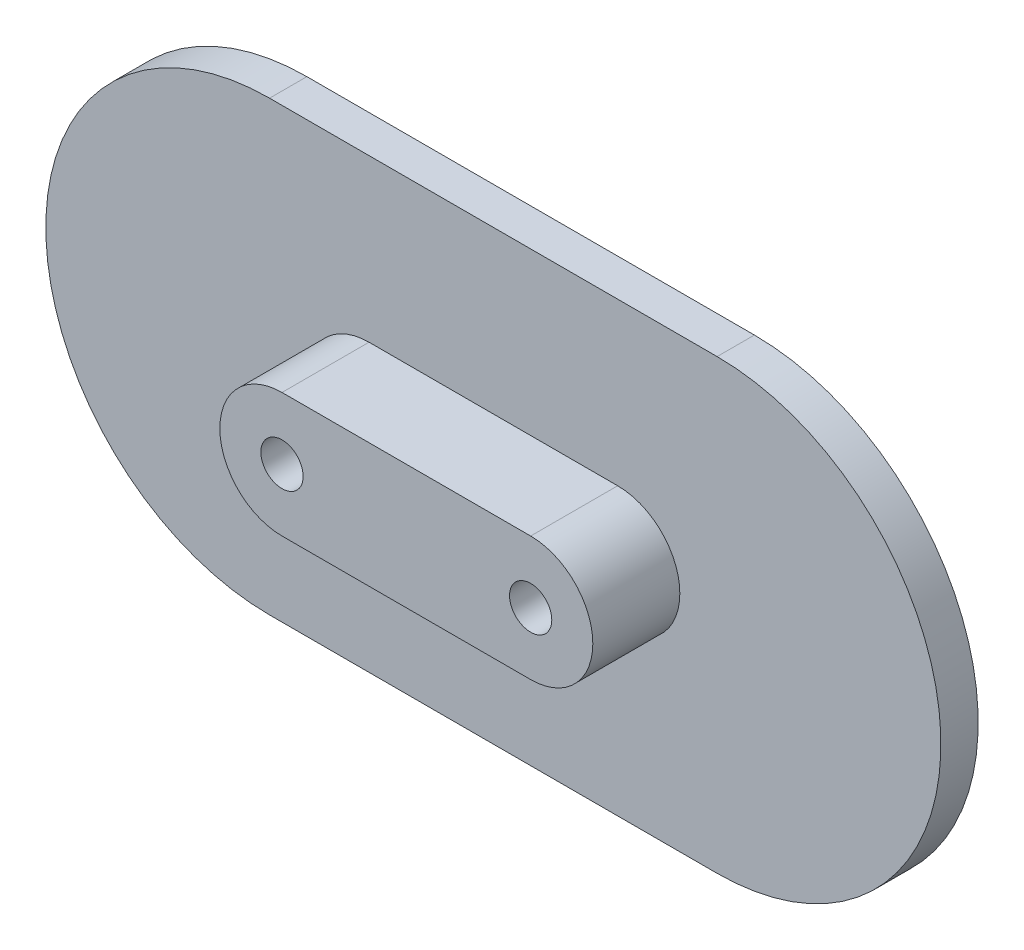
ISO-10303-21;
HEADER;
FILE_DESCRIPTION(('STEP AP214'),'2;1');
FILE_NAME('part.step','',(''),(''),'','','');
FILE_SCHEMA(('AUTOMOTIVE_DESIGN { 1 0 10303 214 1 1 1 1 }'));
ENDSEC;
DATA;
#1=APPLICATION_CONTEXT('core data for automotive mechanical design processes');
#2=APPLICATION_PROTOCOL_DEFINITION('international standard','automotive_design',2000,#1);
#3=PRODUCT_CONTEXT('',#1,'mechanical');
#4=PRODUCT('Part','Part','',(#3));
#5=PRODUCT_RELATED_PRODUCT_CATEGORY('part','',(#4));
#6=PRODUCT_DEFINITION_FORMATION('','',#4);
#7=PRODUCT_DEFINITION_CONTEXT('part definition',#1,'design');
#8=PRODUCT_DEFINITION('design','',#6,#7);
#9=PRODUCT_DEFINITION_SHAPE('','',#8);
#10=(LENGTH_UNIT() NAMED_UNIT(*) SI_UNIT(.MILLI.,.METRE.));
#11=(NAMED_UNIT(*) PLANE_ANGLE_UNIT() SI_UNIT($,.RADIAN.));
#12=(NAMED_UNIT(*) SI_UNIT($,.STERADIAN.) SOLID_ANGLE_UNIT());
#13=UNCERTAINTY_MEASURE_WITH_UNIT(LENGTH_MEASURE(1.E-05),#10,'distance_accuracy_value','');
#14=(GEOMETRIC_REPRESENTATION_CONTEXT(3) GLOBAL_UNCERTAINTY_ASSIGNED_CONTEXT((#13)) GLOBAL_UNIT_ASSIGNED_CONTEXT((#10,
#11,#12)) REPRESENTATION_CONTEXT('',''));
#15=CARTESIAN_POINT('',(0.,0.,0.));
#16=DIRECTION('',(0.,0.,1.));
#17=DIRECTION('',(1.,0.,0.));
#18=AXIS2_PLACEMENT_3D('',#15,#16,#17);
#19=CARTESIAN_POINT('',(0.,-18.,3.));
#20=DIRECTION('',(0.,1.,0.));
#21=DIRECTION('',(0.,0.,1.));
#22=AXIS2_PLACEMENT_3D('',#19,#20,#21);
#23=PLANE('',#22);
#24=DIRECTION('',(1.,0.,0.));
#25=VECTOR('',#24,1.);
#26=CARTESIAN_POINT('',(0.,-18.,0.));
#27=LINE('',#26,#25);
#28=CARTESIAN_POINT('',(-18.,-18.,0.));
#29=VERTEX_POINT('',#28);
#30=CARTESIAN_POINT('',(18.,-18.,0.));
#31=VERTEX_POINT('',#30);
#32=EDGE_CURVE('E124',#29,#31,#27,.T.);
#33=ORIENTED_EDGE('',*,*,#32,.T.);
#34=DIRECTION('',(0.,0.,-1.));
#35=VECTOR('',#34,1.);
#36=CARTESIAN_POINT('',(18.,-18.,3.));
#37=LINE('',#36,#35);
#38=CARTESIAN_POINT('',(18.,-18.,3.));
#39=VERTEX_POINT('',#38);
#40=EDGE_CURVE('E116',#39,#31,#37,.T.);
#41=ORIENTED_EDGE('',*,*,#40,.F.);
#42=DIRECTION('',(1.,0.,0.));
#43=VECTOR('',#42,1.);
#44=CARTESIAN_POINT('',(0.,-18.,3.));
#45=LINE('',#44,#43);
#46=CARTESIAN_POINT('',(-18.,-18.,3.));
#47=VERTEX_POINT('',#46);
#48=EDGE_CURVE('E104',#47,#39,#45,.T.);
#49=ORIENTED_EDGE('',*,*,#48,.F.);
#50=DIRECTION('',(0.,0.,-1.));
#51=VECTOR('',#50,1.);
#52=CARTESIAN_POINT('',(-18.,-18.,3.));
#53=LINE('',#52,#51);
#54=EDGE_CURVE('E120',#47,#29,#53,.T.);
#55=ORIENTED_EDGE('',*,*,#54,.T.);
#56=EDGE_LOOP('',(#33,#41,#49,#55));
#57=FACE_BOUND('',#56,.T.);
#58=ADVANCED_FACE('F39',(#57),#23,.F.);
#59=CARTESIAN_POINT('',(18.,0.,3.));
#60=DIRECTION('',(0.,0.,-1.));
#61=DIRECTION('',(-1.,0.,0.));
#62=AXIS2_PLACEMENT_3D('',#59,#60,#61);
#63=CYLINDRICAL_SURFACE('',#62,18.);
#64=CARTESIAN_POINT('',(18.,0.,0.));
#65=DIRECTION('',(0.,0.,1.));
#66=DIRECTION('',(1.,0.,0.));
#67=AXIS2_PLACEMENT_3D('',#64,#65,#66);
#68=CIRCLE('',#67,18.);
#69=CARTESIAN_POINT('',(18.,18.,0.));
#70=VERTEX_POINT('',#69);
#71=EDGE_CURVE('E112',#31,#70,#68,.T.);
#72=ORIENTED_EDGE('',*,*,#71,.T.);
#73=DIRECTION('',(0.,0.,-1.));
#74=VECTOR('',#73,1.);
#75=CARTESIAN_POINT('',(18.,18.,3.));
#76=LINE('',#75,#74);
#77=CARTESIAN_POINT('',(18.,18.,3.));
#78=VERTEX_POINT('',#77);
#79=EDGE_CURVE('E110',#78,#70,#76,.T.);
#80=ORIENTED_EDGE('',*,*,#79,.F.);
#81=CARTESIAN_POINT('',(18.,0.,3.));
#82=DIRECTION('',(0.,0.,1.));
#83=DIRECTION('',(1.,0.,0.));
#84=AXIS2_PLACEMENT_3D('',#81,#82,#83);
#85=CIRCLE('',#84,18.);
#86=EDGE_CURVE('E98',#39,#78,#85,.T.);
#87=ORIENTED_EDGE('',*,*,#86,.F.);
#88=ORIENTED_EDGE('',*,*,#40,.T.);
#89=EDGE_LOOP('',(#72,#80,#87,#88));
#90=FACE_BOUND('',#89,.T.);
#91=ADVANCED_FACE('F111',(#90),#63,.T.);
#92=CARTESIAN_POINT('',(0.,18.,3.));
#93=DIRECTION('',(0.,1.,0.));
#94=DIRECTION('',(0.,0.,1.));
#95=AXIS2_PLACEMENT_3D('',#92,#93,#94);
#96=PLANE('',#95);
#97=DIRECTION('',(1.,0.,0.));
#98=VECTOR('',#97,1.);
#99=CARTESIAN_POINT('',(0.,18.,0.));
#100=LINE('',#99,#98);
#101=CARTESIAN_POINT('',(-18.,18.,0.));
#102=VERTEX_POINT('',#101);
#103=EDGE_CURVE('E129',#102,#70,#100,.T.);
#104=ORIENTED_EDGE('',*,*,#103,.F.);
#105=DIRECTION('',(0.,0.,-1.));
#106=VECTOR('',#105,1.);
#107=CARTESIAN_POINT('',(-18.,18.,3.));
#108=LINE('',#107,#106);
#109=CARTESIAN_POINT('',(-18.,18.,3.));
#110=VERTEX_POINT('',#109);
#111=EDGE_CURVE('E74',#110,#102,#108,.T.);
#112=ORIENTED_EDGE('',*,*,#111,.F.);
#113=DIRECTION('',(1.,0.,0.));
#114=VECTOR('',#113,1.);
#115=CARTESIAN_POINT('',(0.,18.,3.));
#116=LINE('',#115,#114);
#117=EDGE_CURVE('E102',#110,#78,#116,.T.);
#118=ORIENTED_EDGE('',*,*,#117,.T.);
#119=ORIENTED_EDGE('',*,*,#79,.T.);
#120=EDGE_LOOP('',(#104,#112,#118,#119));
#121=FACE_BOUND('',#120,.T.);
#122=ADVANCED_FACE('F118',(#121),#96,.T.);
#123=CARTESIAN_POINT('',(-18.,0.,3.));
#124=DIRECTION('',(0.,0.,-1.));
#125=DIRECTION('',(-1.,0.,0.));
#126=AXIS2_PLACEMENT_3D('',#123,#124,#125);
#127=CYLINDRICAL_SURFACE('',#126,18.);
#128=CARTESIAN_POINT('',(-18.,0.,0.));
#129=DIRECTION('',(0.,0.,1.));
#130=DIRECTION('',(1.,0.,0.));
#131=AXIS2_PLACEMENT_3D('',#128,#129,#130);
#132=CIRCLE('',#131,18.);
#133=EDGE_CURVE('E77',#102,#29,#132,.T.);
#134=ORIENTED_EDGE('',*,*,#133,.T.);
#135=ORIENTED_EDGE('',*,*,#54,.F.);
#136=CARTESIAN_POINT('',(-18.,0.,3.));
#137=DIRECTION('',(0.,0.,1.));
#138=DIRECTION('',(1.,0.,0.));
#139=AXIS2_PLACEMENT_3D('',#136,#137,#138);
#140=CIRCLE('',#139,18.);
#141=EDGE_CURVE('E57',#110,#47,#140,.T.);
#142=ORIENTED_EDGE('',*,*,#141,.F.);
#143=ORIENTED_EDGE('',*,*,#111,.T.);
#144=EDGE_LOOP('',(#134,#135,#142,#143));
#145=FACE_BOUND('',#144,.T.);
#146=ADVANCED_FACE('F161',(#145),#127,.T.);
#147=CARTESIAN_POINT('',(0.,0.,3.));
#148=DIRECTION('',(0.,0.,1.));
#149=DIRECTION('',(1.,0.,0.));
#150=AXIS2_PLACEMENT_3D('',#147,#148,#149);
#151=PLANE('',#150);
#152=CARTESIAN_POINT('',(10.,0.,3.));
#153=DIRECTION('',(0.,0.,1.));
#154=DIRECTION('',(1.,0.,0.));
#155=AXIS2_PLACEMENT_3D('',#152,#153,#154);
#156=CIRCLE('',#155,5.);
#157=CARTESIAN_POINT('',(10.,-5.,3.));
#158=VERTEX_POINT('',#157);
#159=CARTESIAN_POINT('',(10.,5.,3.));
#160=VERTEX_POINT('',#159);
#161=EDGE_CURVE('E86',#158,#160,#156,.T.);
#162=ORIENTED_EDGE('',*,*,#161,.F.);
#163=DIRECTION('',(1.,0.,0.));
#164=VECTOR('',#163,1.);
#165=CARTESIAN_POINT('',(0.,-5.,3.));
#166=LINE('',#165,#164);
#167=CARTESIAN_POINT('',(-10.,-5.,3.));
#168=VERTEX_POINT('',#167);
#169=EDGE_CURVE('E312',#168,#158,#166,.T.);
#170=ORIENTED_EDGE('',*,*,#169,.F.);
#171=CARTESIAN_POINT('',(-10.,0.,3.));
#172=DIRECTION('',(0.,0.,1.));
#173=DIRECTION('',(1.,0.,0.));
#174=AXIS2_PLACEMENT_3D('',#171,#172,#173);
#175=CIRCLE('',#174,5.);
#176=CARTESIAN_POINT('',(-10.,5.,3.));
#177=VERTEX_POINT('',#176);
#178=EDGE_CURVE('E314',#177,#168,#175,.T.);
#179=ORIENTED_EDGE('',*,*,#178,.F.);
#180=DIRECTION('',(1.,0.,0.));
#181=VECTOR('',#180,1.);
#182=CARTESIAN_POINT('',(0.,5.,3.));
#183=LINE('',#182,#181);
#184=EDGE_CURVE('E317',#177,#160,#183,.T.);
#185=ORIENTED_EDGE('',*,*,#184,.T.);
#186=EDGE_LOOP('',(#162,#170,#179,#185));
#187=FACE_BOUND('',#186,.T.);
#188=ORIENTED_EDGE('',*,*,#48,.T.);
#189=ORIENTED_EDGE('',*,*,#86,.T.);
#190=ORIENTED_EDGE('',*,*,#117,.F.);
#191=ORIENTED_EDGE('',*,*,#141,.T.);
#192=EDGE_LOOP('',(#188,#189,#190,#191));
#193=FACE_BOUND('',#192,.T.);
#194=ADVANCED_FACE('F100',(#187,#193),#151,.T.);
#195=CARTESIAN_POINT('',(0.,0.,0.));
#196=DIRECTION('',(0.,0.,1.));
#197=DIRECTION('',(1.,0.,0.));
#198=AXIS2_PLACEMENT_3D('',#195,#196,#197);
#199=PLANE('',#198);
#200=CARTESIAN_POINT('',(10.,0.,0.));
#201=DIRECTION('',(0.,0.,1.));
#202=DIRECTION('',(1.,0.,0.));
#203=AXIS2_PLACEMENT_3D('',#200,#201,#202);
#204=CIRCLE('',#203,3.1);
#205=CARTESIAN_POINT('',(13.1,0.,0.));
#206=VERTEX_POINT('',#205);
#207=EDGE_CURVE('E138',#206,#206,#204,.T.);
#208=ORIENTED_EDGE('',*,*,#207,.T.);
#209=EDGE_LOOP('',(#208));
#210=FACE_BOUND('',#209,.T.);
#211=CARTESIAN_POINT('',(-10.,0.,0.));
#212=DIRECTION('',(0.,0.,1.));
#213=DIRECTION('',(1.,0.,0.));
#214=AXIS2_PLACEMENT_3D('',#211,#212,#213);
#215=CIRCLE('',#214,3.1);
#216=CARTESIAN_POINT('',(-6.9,0.,0.));
#217=VERTEX_POINT('',#216);
#218=EDGE_CURVE('E135',#217,#217,#215,.T.);
#219=ORIENTED_EDGE('',*,*,#218,.T.);
#220=EDGE_LOOP('',(#219));
#221=FACE_BOUND('',#220,.T.);
#222=ORIENTED_EDGE('',*,*,#32,.F.);
#223=ORIENTED_EDGE('',*,*,#133,.F.);
#224=ORIENTED_EDGE('',*,*,#103,.T.);
#225=ORIENTED_EDGE('',*,*,#71,.F.);
#226=EDGE_LOOP('',(#222,#223,#224,#225));
#227=FACE_BOUND('',#226,.T.);
#228=ADVANCED_FACE('F152',(#210,#221,#227),#199,.F.);
#229=CARTESIAN_POINT('',(0.,-5.,10.));
#230=DIRECTION('',(0.,1.,0.));
#231=DIRECTION('',(0.,0.,1.));
#232=AXIS2_PLACEMENT_3D('',#229,#230,#231);
#233=PLANE('',#232);
#234=ORIENTED_EDGE('',*,*,#169,.T.);
#235=DIRECTION('',(0.,0.,-1.));
#236=VECTOR('',#235,1.);
#237=CARTESIAN_POINT('',(10.,-5.,10.));
#238=LINE('',#237,#236);
#239=CARTESIAN_POINT('',(10.,-5.,10.));
#240=VERTEX_POINT('',#239);
#241=EDGE_CURVE('E127',#240,#158,#238,.T.);
#242=ORIENTED_EDGE('',*,*,#241,.F.);
#243=DIRECTION('',(1.,0.,0.));
#244=VECTOR('',#243,1.);
#245=CARTESIAN_POINT('',(0.,-5.,10.));
#246=LINE('',#245,#244);
#247=CARTESIAN_POINT('',(-10.,-5.,10.));
#248=VERTEX_POINT('',#247);
#249=EDGE_CURVE('E332',#248,#240,#246,.T.);
#250=ORIENTED_EDGE('',*,*,#249,.F.);
#251=DIRECTION('',(0.,0.,-1.));
#252=VECTOR('',#251,1.);
#253=CARTESIAN_POINT('',(-10.,-5.,10.));
#254=LINE('',#253,#252);
#255=EDGE_CURVE('E294',#248,#168,#254,.T.);
#256=ORIENTED_EDGE('',*,*,#255,.T.);
#257=EDGE_LOOP('',(#234,#242,#250,#256));
#258=FACE_BOUND('',#257,.T.);
#259=ADVANCED_FACE('F155',(#258),#233,.F.);
#260=CARTESIAN_POINT('',(10.,0.,10.));
#261=DIRECTION('',(0.,0.,-1.));
#262=DIRECTION('',(-1.,0.,0.));
#263=AXIS2_PLACEMENT_3D('',#260,#261,#262);
#264=CYLINDRICAL_SURFACE('',#263,5.);
#265=ORIENTED_EDGE('',*,*,#161,.T.);
#266=DIRECTION('',(0.,0.,-1.));
#267=VECTOR('',#266,1.);
#268=CARTESIAN_POINT('',(10.,5.,10.));
#269=LINE('',#268,#267);
#270=CARTESIAN_POINT('',(10.,5.,10.));
#271=VERTEX_POINT('',#270);
#272=EDGE_CURVE('E306',#271,#160,#269,.T.);
#273=ORIENTED_EDGE('',*,*,#272,.F.);
#274=CARTESIAN_POINT('',(10.,0.,10.));
#275=DIRECTION('',(0.,0.,1.));
#276=DIRECTION('',(1.,0.,0.));
#277=AXIS2_PLACEMENT_3D('',#274,#275,#276);
#278=CIRCLE('',#277,5.);
#279=EDGE_CURVE('E331',#240,#271,#278,.T.);
#280=ORIENTED_EDGE('',*,*,#279,.F.);
#281=ORIENTED_EDGE('',*,*,#241,.T.);
#282=EDGE_LOOP('',(#265,#273,#280,#281));
#283=FACE_BOUND('',#282,.T.);
#284=ADVANCED_FACE('F208',(#283),#264,.T.);
#285=CARTESIAN_POINT('',(0.,5.,10.));
#286=DIRECTION('',(0.,1.,0.));
#287=DIRECTION('',(0.,0.,1.));
#288=AXIS2_PLACEMENT_3D('',#285,#286,#287);
#289=PLANE('',#288);
#290=ORIENTED_EDGE('',*,*,#272,.T.);
#291=ORIENTED_EDGE('',*,*,#184,.F.);
#292=DIRECTION('',(0.,0.,-1.));
#293=VECTOR('',#292,1.);
#294=CARTESIAN_POINT('',(-10.,5.,10.));
#295=LINE('',#294,#293);
#296=CARTESIAN_POINT('',(-10.,5.,10.));
#297=VERTEX_POINT('',#296);
#298=EDGE_CURVE('E303',#297,#177,#295,.T.);
#299=ORIENTED_EDGE('',*,*,#298,.F.);
#300=DIRECTION('',(1.,0.,0.));
#301=VECTOR('',#300,1.);
#302=CARTESIAN_POINT('',(0.,5.,10.));
#303=LINE('',#302,#301);
#304=EDGE_CURVE('E297',#297,#271,#303,.T.);
#305=ORIENTED_EDGE('',*,*,#304,.T.);
#306=EDGE_LOOP('',(#290,#291,#299,#305));
#307=FACE_BOUND('',#306,.T.);
#308=ADVANCED_FACE('F219',(#307),#289,.T.);
#309=CARTESIAN_POINT('',(-10.,0.,10.));
#310=DIRECTION('',(0.,0.,-1.));
#311=DIRECTION('',(-1.,0.,0.));
#312=AXIS2_PLACEMENT_3D('',#309,#310,#311);
#313=CYLINDRICAL_SURFACE('',#312,1.7);
#314=CARTESIAN_POINT('',(-10.,0.,1.40000000000001));
#315=DIRECTION('',(0.,0.,1.));
#316=DIRECTION('',(1.,0.,0.));
#317=AXIS2_PLACEMENT_3D('',#314,#315,#316);
#318=CIRCLE('',#317,1.7);
#319=CARTESIAN_POINT('',(-8.3,0.,1.40000000000001));
#320=VERTEX_POINT('',#319);
#321=EDGE_CURVE('E11',#320,#320,#318,.F.);
#322=ORIENTED_EDGE('',*,*,#321,.T.);
#323=EDGE_LOOP('',(#322));
#324=FACE_BOUND('',#323,.T.);
#325=CARTESIAN_POINT('',(-10.,0.,10.));
#326=DIRECTION('',(0.,0.,1.));
#327=DIRECTION('',(1.,0.,0.));
#328=AXIS2_PLACEMENT_3D('',#325,#326,#327);
#329=CIRCLE('',#328,1.7);
#330=CARTESIAN_POINT('',(-8.3,0.,10.));
#331=VERTEX_POINT('',#330);
#332=EDGE_CURVE('E288',#331,#331,#329,.T.);
#333=ORIENTED_EDGE('',*,*,#332,.T.);
#334=EDGE_LOOP('',(#333));
#335=FACE_BOUND('',#334,.T.);
#336=ADVANCED_FACE('F229',(#324,#335),#313,.F.);
#337=CARTESIAN_POINT('',(-10.,0.,10.));
#338=DIRECTION('',(0.,0.,-1.));
#339=DIRECTION('',(-1.,0.,0.));
#340=AXIS2_PLACEMENT_3D('',#337,#338,#339);
#341=CYLINDRICAL_SURFACE('',#340,5.);
#342=ORIENTED_EDGE('',*,*,#178,.T.);
#343=ORIENTED_EDGE('',*,*,#255,.F.);
#344=CARTESIAN_POINT('',(-10.,0.,10.));
#345=DIRECTION('',(0.,0.,1.));
#346=DIRECTION('',(1.,0.,0.));
#347=AXIS2_PLACEMENT_3D('',#344,#345,#346);
#348=CIRCLE('',#347,5.);
#349=EDGE_CURVE('E291',#297,#248,#348,.T.);
#350=ORIENTED_EDGE('',*,*,#349,.F.);
#351=ORIENTED_EDGE('',*,*,#298,.T.);
#352=EDGE_LOOP('',(#342,#343,#350,#351));
#353=FACE_BOUND('',#352,.T.);
#354=ADVANCED_FACE('F237',(#353),#341,.T.);
#355=CARTESIAN_POINT('',(10.,0.,10.));
#356=DIRECTION('',(0.,0.,-1.));
#357=DIRECTION('',(-1.,0.,0.));
#358=AXIS2_PLACEMENT_3D('',#355,#356,#357);
#359=CYLINDRICAL_SURFACE('',#358,1.7);
#360=CARTESIAN_POINT('',(10.,0.,1.40000000000001));
#361=DIRECTION('',(0.,0.,1.));
#362=DIRECTION('',(1.,0.,0.));
#363=AXIS2_PLACEMENT_3D('',#360,#361,#362);
#364=CIRCLE('',#363,1.7);
#365=CARTESIAN_POINT('',(11.7,0.,1.40000000000001));
#366=VERTEX_POINT('',#365);
#367=EDGE_CURVE('E49',#366,#366,#364,.F.);
#368=ORIENTED_EDGE('',*,*,#367,.T.);
#369=EDGE_LOOP('',(#368));
#370=FACE_BOUND('',#369,.T.);
#371=CARTESIAN_POINT('',(10.,0.,10.));
#372=DIRECTION('',(0.,0.,1.));
#373=DIRECTION('',(1.,0.,0.));
#374=AXIS2_PLACEMENT_3D('',#371,#372,#373);
#375=CIRCLE('',#374,1.7);
#376=CARTESIAN_POINT('',(11.7,0.,10.));
#377=VERTEX_POINT('',#376);
#378=EDGE_CURVE('E290',#377,#377,#375,.T.);
#379=ORIENTED_EDGE('',*,*,#378,.T.);
#380=EDGE_LOOP('',(#379));
#381=FACE_BOUND('',#380,.T.);
#382=ADVANCED_FACE('F143',(#370,#381),#359,.F.);
#383=CARTESIAN_POINT('',(0.,0.,10.));
#384=DIRECTION('',(0.,0.,1.));
#385=DIRECTION('',(1.,0.,0.));
#386=AXIS2_PLACEMENT_3D('',#383,#384,#385);
#387=PLANE('',#386);
#388=ORIENTED_EDGE('',*,*,#249,.T.);
#389=ORIENTED_EDGE('',*,*,#279,.T.);
#390=ORIENTED_EDGE('',*,*,#304,.F.);
#391=ORIENTED_EDGE('',*,*,#349,.T.);
#392=EDGE_LOOP('',(#388,#389,#390,#391));
#393=FACE_BOUND('',#392,.T.);
#394=ORIENTED_EDGE('',*,*,#332,.F.);
#395=EDGE_LOOP('',(#394));
#396=FACE_BOUND('',#395,.T.);
#397=ORIENTED_EDGE('',*,*,#378,.F.);
#398=EDGE_LOOP('',(#397));
#399=FACE_BOUND('',#398,.T.);
#400=ADVANCED_FACE('F149',(#393,#396,#399),#387,.T.);
#401=CARTESIAN_POINT('',(10.,0.,0.));
#402=DIRECTION('',(0.,0.,-1.));
#403=DIRECTION('',(-1.,0.,0.));
#404=AXIS2_PLACEMENT_3D('',#401,#402,#403);
#405=CONICAL_SURFACE('',#404,3.1,0.785398163397446);
#406=ORIENTED_EDGE('',*,*,#367,.F.);
#407=EDGE_LOOP('',(#406));
#408=FACE_BOUND('',#407,.T.);
#409=ORIENTED_EDGE('',*,*,#207,.F.);
#410=EDGE_LOOP('',(#409));
#411=FACE_BOUND('',#410,.T.);
#412=ADVANCED_FACE('F146',(#408,#411),#405,.F.);
#413=CARTESIAN_POINT('',(-10.,0.,0.));
#414=DIRECTION('',(0.,0.,-1.));
#415=DIRECTION('',(-1.,0.,0.));
#416=AXIS2_PLACEMENT_3D('',#413,#414,#415);
#417=CONICAL_SURFACE('',#416,3.1,0.785398163397445);
#418=ORIENTED_EDGE('',*,*,#321,.F.);
#419=EDGE_LOOP('',(#418));
#420=FACE_BOUND('',#419,.T.);
#421=ORIENTED_EDGE('',*,*,#218,.F.);
#422=EDGE_LOOP('',(#421));
#423=FACE_BOUND('',#422,.T.);
#424=ADVANCED_FACE('F42',(#420,#423),#417,.F.);
#425=CLOSED_SHELL('',(#58,#91,#122,#146,#194,#228,#259,#284,#308,#336,#354,#382,#400,#412,#424));
#426=MANIFOLD_SOLID_BREP('B2',#425);
#427=ADVANCED_BREP_SHAPE_REPRESENTATION('',(#18,#426),#14);
#428=SHAPE_DEFINITION_REPRESENTATION(#9,#427);
ENDSEC;
END-ISO-10303-21;
